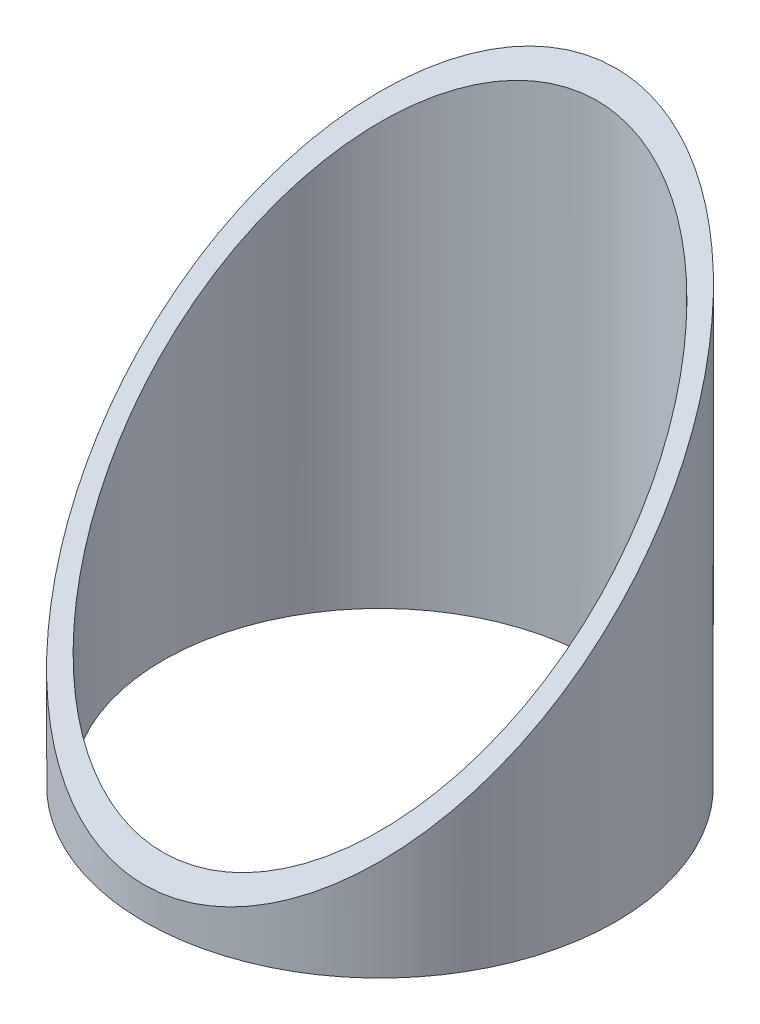
ISO-10303-21;
HEADER;
FILE_DESCRIPTION(('STEP AP214'),'2;1');
FILE_NAME('part.step','',(''),(''),'','','');
FILE_SCHEMA(('AUTOMOTIVE_DESIGN { 1 0 10303 214 1 1 1 1 }'));
ENDSEC;
DATA;
#1=APPLICATION_CONTEXT('core data for automotive mechanical design processes');
#2=APPLICATION_PROTOCOL_DEFINITION('international standard','automotive_design',2000,#1);
#3=PRODUCT_CONTEXT('',#1,'mechanical');
#4=PRODUCT('Part','Part','',(#3));
#5=PRODUCT_RELATED_PRODUCT_CATEGORY('part','',(#4));
#6=PRODUCT_DEFINITION_FORMATION('','',#4);
#7=PRODUCT_DEFINITION_CONTEXT('part definition',#1,'design');
#8=PRODUCT_DEFINITION('design','',#6,#7);
#9=PRODUCT_DEFINITION_SHAPE('','',#8);
#10=(LENGTH_UNIT() NAMED_UNIT(*) SI_UNIT(.MILLI.,.METRE.));
#11=(NAMED_UNIT(*) PLANE_ANGLE_UNIT() SI_UNIT($,.RADIAN.));
#12=(NAMED_UNIT(*) SI_UNIT($,.STERADIAN.) SOLID_ANGLE_UNIT());
#13=UNCERTAINTY_MEASURE_WITH_UNIT(LENGTH_MEASURE(1.E-05),#10,'distance_accuracy_value','');
#14=(GEOMETRIC_REPRESENTATION_CONTEXT(3) GLOBAL_UNCERTAINTY_ASSIGNED_CONTEXT((#13)) GLOBAL_UNIT_ASSIGNED_CONTEXT((#10,
#11,#12)) REPRESENTATION_CONTEXT('',''));
#15=CARTESIAN_POINT('',(0.,0.,0.));
#16=DIRECTION('',(0.,0.,1.));
#17=DIRECTION('',(1.,0.,0.));
#18=AXIS2_PLACEMENT_3D('',#15,#16,#17);
#19=CARTESIAN_POINT('',(0.,13.802,-7.4));
#20=DIRECTION('',(0.,-1.,0.));
#21=DIRECTION('',(0.,0.,-1.));
#22=AXIS2_PLACEMENT_3D('',#19,#20,#21);
#23=CYLINDRICAL_SURFACE('',#22,6.28);
#24=CARTESIAN_POINT('',(0.,6.40000000000928,-7.4));
#25=DIRECTION('',(0.,0.707106781186546,0.707106781186549));
#26=DIRECTION('',(0.,-0.707106781186549,0.707106781186546));
#27=AXIS2_PLACEMENT_3D('',#24,#25,#26);
#28=ELLIPSE('',#27,8.88126117170305,6.28);
#29=CARTESIAN_POINT('',(0.,0.120000000009262,-1.12));
#30=VERTEX_POINT('',#29);
#31=EDGE_CURVE('E11',#30,#30,#28,.T.);
#32=ORIENTED_EDGE('',*,*,#31,.F.);
#33=EDGE_LOOP('',(#32));
#34=FACE_BOUND('',#33,.T.);
#35=CARTESIAN_POINT('',(0.,-0.73,-7.4));
#36=DIRECTION('',(0.,-1.,0.));
#37=DIRECTION('',(0.,0.,-1.));
#38=AXIS2_PLACEMENT_3D('',#35,#36,#37);
#39=CIRCLE('',#38,6.28);
#40=CARTESIAN_POINT('',(0.,-0.73,-13.68));
#41=VERTEX_POINT('',#40);
#42=EDGE_CURVE('E50',#41,#41,#39,.T.);
#43=ORIENTED_EDGE('',*,*,#42,.F.);
#44=EDGE_LOOP('',(#43));
#45=FACE_BOUND('',#44,.T.);
#46=ADVANCED_FACE('F37',(#34,#45),#23,.T.);
#47=CARTESIAN_POINT('',(0.,13.802,-7.4));
#48=DIRECTION('',(0.,-1.,0.));
#49=DIRECTION('',(0.,0.,-1.));
#50=AXIS2_PLACEMENT_3D('',#47,#48,#49);
#51=CYLINDRICAL_SURFACE('',#50,5.78);
#52=CARTESIAN_POINT('',(0.,6.40000000000928,-7.4));
#53=DIRECTION('',(0.,0.707106781186546,0.707106781186549));
#54=DIRECTION('',(0.,-0.707106781186549,0.707106781186546));
#55=AXIS2_PLACEMENT_3D('',#52,#53,#54);
#56=ELLIPSE('',#55,8.1741543905165,5.78);
#57=CARTESIAN_POINT('',(0.,0.620000000009264,-1.62));
#58=VERTEX_POINT('',#57);
#59=EDGE_CURVE('E45',#58,#58,#56,.T.);
#60=ORIENTED_EDGE('',*,*,#59,.T.);
#61=EDGE_LOOP('',(#60));
#62=FACE_BOUND('',#61,.T.);
#63=CARTESIAN_POINT('',(0.,-0.73,-7.4));
#64=DIRECTION('',(0.,-1.,0.));
#65=DIRECTION('',(0.,0.,-1.));
#66=AXIS2_PLACEMENT_3D('',#63,#64,#65);
#67=CIRCLE('',#66,5.78);
#68=CARTESIAN_POINT('',(0.,-0.73,-13.18));
#69=VERTEX_POINT('',#68);
#70=EDGE_CURVE('E41',#69,#69,#67,.T.);
#71=ORIENTED_EDGE('',*,*,#70,.T.);
#72=EDGE_LOOP('',(#71));
#73=FACE_BOUND('',#72,.T.);
#74=ADVANCED_FACE('F58',(#62,#73),#51,.F.);
#75=CARTESIAN_POINT('',(0.,13.6421356237356,-14.6421356237263));
#76=DIRECTION('',(0.,0.707106781186546,0.707106781186549));
#77=DIRECTION('',(0.,-0.707106781186549,0.707106781186546));
#78=AXIS2_PLACEMENT_3D('',#75,#76,#77);
#79=PLANE('',#78);
#80=ORIENTED_EDGE('',*,*,#59,.F.);
#81=EDGE_LOOP('',(#80));
#82=FACE_BOUND('',#81,.T.);
#83=ORIENTED_EDGE('',*,*,#31,.T.);
#84=EDGE_LOOP('',(#83));
#85=FACE_BOUND('',#84,.T.);
#86=ADVANCED_FACE('F39',(#82,#85),#79,.T.);
#87=CARTESIAN_POINT('',(0.,-0.73,-7.39533710165396));
#88=DIRECTION('',(0.,-1.,0.));
#89=DIRECTION('',(0.,0.,-1.));
#90=AXIS2_PLACEMENT_3D('',#87,#88,#89);
#91=PLANE('',#90);
#92=ORIENTED_EDGE('',*,*,#70,.F.);
#93=EDGE_LOOP('',(#92));
#94=FACE_BOUND('',#93,.T.);
#95=ORIENTED_EDGE('',*,*,#42,.T.);
#96=EDGE_LOOP('',(#95));
#97=FACE_BOUND('',#96,.T.);
#98=ADVANCED_FACE('F60',(#94,#97),#91,.T.);
#99=CLOSED_SHELL('',(#46,#74,#86,#98));
#100=MANIFOLD_SOLID_BREP('B2',#99);
#101=ADVANCED_BREP_SHAPE_REPRESENTATION('',(#18,#100),#14);
#102=SHAPE_DEFINITION_REPRESENTATION(#9,#101);
ENDSEC;
END-ISO-10303-21;
